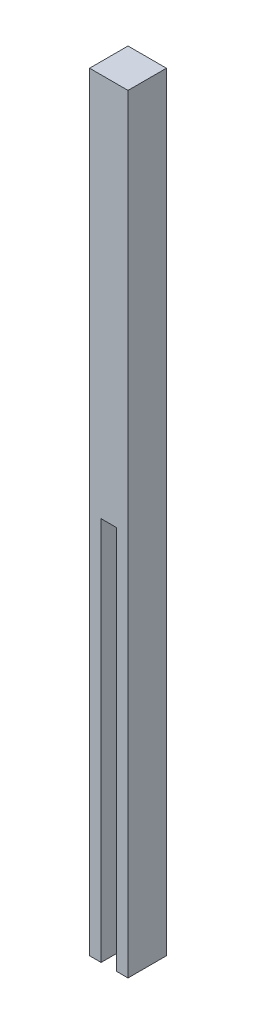
ISO-10303-21;
HEADER;
FILE_DESCRIPTION(('STEP AP214'),'2;1');
FILE_NAME('part.step','',(''),(''),'','','');
FILE_SCHEMA(('AUTOMOTIVE_DESIGN { 1 0 10303 214 1 1 1 1 }'));
ENDSEC;
DATA;
#1=APPLICATION_CONTEXT('core data for automotive mechanical design processes');
#2=APPLICATION_PROTOCOL_DEFINITION('international standard','automotive_design',2000,#1);
#3=PRODUCT_CONTEXT('',#1,'mechanical');
#4=PRODUCT('Part','Part','',(#3));
#5=PRODUCT_RELATED_PRODUCT_CATEGORY('part','',(#4));
#6=PRODUCT_DEFINITION_FORMATION('','',#4);
#7=PRODUCT_DEFINITION_CONTEXT('part definition',#1,'design');
#8=PRODUCT_DEFINITION('design','',#6,#7);
#9=PRODUCT_DEFINITION_SHAPE('','',#8);
#10=(LENGTH_UNIT() NAMED_UNIT(*) SI_UNIT(.MILLI.,.METRE.));
#11=(NAMED_UNIT(*) PLANE_ANGLE_UNIT() SI_UNIT($,.RADIAN.));
#12=(NAMED_UNIT(*) SI_UNIT($,.STERADIAN.) SOLID_ANGLE_UNIT());
#13=UNCERTAINTY_MEASURE_WITH_UNIT(LENGTH_MEASURE(1.E-05),#10,'distance_accuracy_value','');
#14=(GEOMETRIC_REPRESENTATION_CONTEXT(3) GLOBAL_UNCERTAINTY_ASSIGNED_CONTEXT((#13)) GLOBAL_UNIT_ASSIGNED_CONTEXT((#10,
#11,#12)) REPRESENTATION_CONTEXT('',''));
#15=CARTESIAN_POINT('',(0.,0.,0.));
#16=DIRECTION('',(0.,0.,1.));
#17=DIRECTION('',(1.,0.,0.));
#18=AXIS2_PLACEMENT_3D('',#15,#16,#17);
#19=CARTESIAN_POINT('',(-43.4918902303552,2000.,-32.6944400252682));
#20=DIRECTION('',(1.,0.,0.));
#21=DIRECTION('',(0.,0.,-1.));
#22=AXIS2_PLACEMENT_3D('',#19,#20,#21);
#23=PLANE('',#22);
#24=DIRECTION('',(0.,0.,1.));
#25=VECTOR('',#24,1.);
#26=CARTESIAN_POINT('',(-43.4918902303552,0.,-32.6944400252682));
#27=LINE('',#26,#25);
#28=CARTESIAN_POINT('',(-43.4918902303552,0.,-32.6944400252682));
#29=VERTEX_POINT('',#28);
#30=CARTESIAN_POINT('',(-43.4918902303552,0.,67.3055599747318));
#31=VERTEX_POINT('',#30);
#32=EDGE_CURVE('E142',#29,#31,#27,.T.);
#33=ORIENTED_EDGE('',*,*,#32,.T.);
#34=DIRECTION('',(0.,-1.,0.));
#35=VECTOR('',#34,1.);
#36=CARTESIAN_POINT('',(-43.4918902303552,2000.,67.3055599747318));
#37=LINE('',#36,#35);
#38=CARTESIAN_POINT('',(-43.4918902303552,2000.,67.3055599747318));
#39=VERTEX_POINT('',#38);
#40=EDGE_CURVE('E11',#39,#31,#37,.T.);
#41=ORIENTED_EDGE('',*,*,#40,.F.);
#42=DIRECTION('',(0.,0.,1.));
#43=VECTOR('',#42,1.);
#44=CARTESIAN_POINT('',(-43.4918902303552,2000.,-32.6944400252682));
#45=LINE('',#44,#43);
#46=CARTESIAN_POINT('',(-43.4918902303552,2000.,-32.6944400252682));
#47=VERTEX_POINT('',#46);
#48=EDGE_CURVE('E135',#47,#39,#45,.T.);
#49=ORIENTED_EDGE('',*,*,#48,.F.);
#50=DIRECTION('',(0.,-1.,0.));
#51=VECTOR('',#50,1.);
#52=CARTESIAN_POINT('',(-43.4918902303552,2000.,-32.6944400252682));
#53=LINE('',#52,#51);
#54=EDGE_CURVE('E141',#47,#29,#53,.T.);
#55=ORIENTED_EDGE('',*,*,#54,.T.);
#56=EDGE_LOOP('',(#33,#41,#49,#55));
#57=FACE_BOUND('',#56,.T.);
#58=ADVANCED_FACE('F34',(#57),#23,.F.);
#59=CARTESIAN_POINT('',(-43.4918902303552,2000.,67.3055599747318));
#60=DIRECTION('',(0.,0.,-1.));
#61=DIRECTION('',(-1.,0.,0.));
#62=AXIS2_PLACEMENT_3D('',#59,#60,#61);
#63=PLANE('',#62);
#64=DIRECTION('',(1.,0.,0.));
#65=VECTOR('',#64,1.);
#66=CARTESIAN_POINT('',(-43.4918902303552,0.,67.3055599747318));
#67=LINE('',#66,#65);
#68=CARTESIAN_POINT('',(-13.491890230355,0.,67.3055599747318));
#69=VERTEX_POINT('',#68);
#70=EDGE_CURVE('E145',#31,#69,#67,.T.);
#71=ORIENTED_EDGE('',*,*,#70,.T.);
#72=DIRECTION('',(0.,-1.,0.));
#73=VECTOR('',#72,1.);
#74=CARTESIAN_POINT('',(-13.4918902303552,1000.,67.3055599747318));
#75=LINE('',#74,#73);
#76=CARTESIAN_POINT('',(-13.4918902303552,1000.,67.3055599747318));
#77=VERTEX_POINT('',#76);
#78=EDGE_CURVE('E184',#77,#69,#75,.T.);
#79=ORIENTED_EDGE('',*,*,#78,.F.);
#80=DIRECTION('',(1.,0.,0.));
#81=VECTOR('',#80,1.);
#82=CARTESIAN_POINT('',(-13.4918902303552,1000.,67.3055599747318));
#83=LINE('',#82,#81);
#84=CARTESIAN_POINT('',(26.5081097696449,1000.,67.3055599747318));
#85=VERTEX_POINT('',#84);
#86=EDGE_CURVE('E186',#77,#85,#83,.T.);
#87=ORIENTED_EDGE('',*,*,#86,.T.);
#88=DIRECTION('',(0.,-1.,0.));
#89=VECTOR('',#88,1.);
#90=CARTESIAN_POINT('',(26.5081097696449,1000.,67.3055599747318));
#91=LINE('',#90,#89);
#92=CARTESIAN_POINT('',(26.508109769645,0.,67.3055599747318));
#93=VERTEX_POINT('',#92);
#94=EDGE_CURVE('E188',#85,#93,#91,.T.);
#95=ORIENTED_EDGE('',*,*,#94,.T.);
#96=CARTESIAN_POINT('',(56.5081097696448,0.,67.3055599747318));
#97=VERTEX_POINT('',#96);
#98=EDGE_CURVE('E127',#93,#97,#67,.T.);
#99=ORIENTED_EDGE('',*,*,#98,.T.);
#100=DIRECTION('',(0.,-1.,0.));
#101=VECTOR('',#100,1.);
#102=CARTESIAN_POINT('',(56.5081097696448,2000.,67.3055599747318));
#103=LINE('',#102,#101);
#104=CARTESIAN_POINT('',(56.5081097696448,2000.,67.3055599747318));
#105=VERTEX_POINT('',#104);
#106=EDGE_CURVE('E41',#105,#97,#103,.T.);
#107=ORIENTED_EDGE('',*,*,#106,.F.);
#108=DIRECTION('',(1.,0.,0.));
#109=VECTOR('',#108,1.);
#110=CARTESIAN_POINT('',(-43.4918902303552,2000.,67.3055599747318));
#111=LINE('',#110,#109);
#112=EDGE_CURVE('E85',#39,#105,#111,.T.);
#113=ORIENTED_EDGE('',*,*,#112,.F.);
#114=ORIENTED_EDGE('',*,*,#40,.T.);
#115=EDGE_LOOP('',(#71,#79,#87,#95,#99,#107,#113,#114));
#116=FACE_BOUND('',#115,.T.);
#117=ADVANCED_FACE('F171',(#116),#63,.F.);
#118=CARTESIAN_POINT('',(56.5081097696448,2000.,-32.6944400252682));
#119=DIRECTION('',(-1.,0.,0.));
#120=DIRECTION('',(0.,0.,1.));
#121=AXIS2_PLACEMENT_3D('',#118,#119,#120);
#122=PLANE('',#121);
#123=DIRECTION('',(0.,0.,-1.));
#124=VECTOR('',#123,1.);
#125=CARTESIAN_POINT('',(56.5081097696448,0.,-32.6944400252682));
#126=LINE('',#125,#124);
#127=CARTESIAN_POINT('',(56.5081097696448,0.,-32.6944400252682));
#128=VERTEX_POINT('',#127);
#129=EDGE_CURVE('E148',#97,#128,#126,.T.);
#130=ORIENTED_EDGE('',*,*,#129,.T.);
#131=DIRECTION('',(0.,-1.,0.));
#132=VECTOR('',#131,1.);
#133=CARTESIAN_POINT('',(56.5081097696448,2000.,-32.6944400252682));
#134=LINE('',#133,#132);
#135=CARTESIAN_POINT('',(56.5081097696448,2000.,-32.6944400252682));
#136=VERTEX_POINT('',#135);
#137=EDGE_CURVE('E152',#136,#128,#134,.T.);
#138=ORIENTED_EDGE('',*,*,#137,.F.);
#139=DIRECTION('',(0.,0.,-1.));
#140=VECTOR('',#139,1.);
#141=CARTESIAN_POINT('',(56.5081097696448,2000.,-32.6944400252682));
#142=LINE('',#141,#140);
#143=EDGE_CURVE('E138',#105,#136,#142,.T.);
#144=ORIENTED_EDGE('',*,*,#143,.F.);
#145=ORIENTED_EDGE('',*,*,#106,.T.);
#146=EDGE_LOOP('',(#130,#138,#144,#145));
#147=FACE_BOUND('',#146,.T.);
#148=ADVANCED_FACE('F156',(#147),#122,.F.);
#149=CARTESIAN_POINT('',(-43.4918902303552,2000.,-32.6944400252682));
#150=DIRECTION('',(0.,0.,1.));
#151=DIRECTION('',(1.,0.,0.));
#152=AXIS2_PLACEMENT_3D('',#149,#150,#151);
#153=PLANE('',#152);
#154=DIRECTION('',(-1.,0.,0.));
#155=VECTOR('',#154,1.);
#156=CARTESIAN_POINT('',(-43.4918902303552,0.,-32.6944400252682));
#157=LINE('',#156,#155);
#158=EDGE_CURVE('E78',#128,#29,#157,.T.);
#159=ORIENTED_EDGE('',*,*,#158,.T.);
#160=ORIENTED_EDGE('',*,*,#54,.F.);
#161=DIRECTION('',(-1.,0.,0.));
#162=VECTOR('',#161,1.);
#163=CARTESIAN_POINT('',(-43.4918902303552,2000.,-32.6944400252682));
#164=LINE('',#163,#162);
#165=EDGE_CURVE('E57',#136,#47,#164,.T.);
#166=ORIENTED_EDGE('',*,*,#165,.F.);
#167=ORIENTED_EDGE('',*,*,#137,.T.);
#168=EDGE_LOOP('',(#159,#160,#166,#167));
#169=FACE_BOUND('',#168,.T.);
#170=ADVANCED_FACE('F162',(#169),#153,.F.);
#171=CARTESIAN_POINT('',(0.,2000.,0.));
#172=DIRECTION('',(0.,1.,0.));
#173=DIRECTION('',(0.,0.,1.));
#174=AXIS2_PLACEMENT_3D('',#171,#172,#173);
#175=PLANE('',#174);
#176=ORIENTED_EDGE('',*,*,#48,.T.);
#177=ORIENTED_EDGE('',*,*,#112,.T.);
#178=ORIENTED_EDGE('',*,*,#143,.T.);
#179=ORIENTED_EDGE('',*,*,#165,.T.);
#180=EDGE_LOOP('',(#176,#177,#178,#179));
#181=FACE_BOUND('',#180,.T.);
#182=ADVANCED_FACE('F164',(#181),#175,.T.);
#183=CARTESIAN_POINT('',(0.,0.,0.));
#184=DIRECTION('',(0.,1.,0.));
#185=DIRECTION('',(0.,0.,1.));
#186=AXIS2_PLACEMENT_3D('',#183,#184,#185);
#187=PLANE('',#186);
#188=DIRECTION('',(1.,0.,0.));
#189=VECTOR('',#188,1.);
#190=CARTESIAN_POINT('',(-13.491890230355,0.,27.3055599747318));
#191=LINE('',#190,#189);
#192=CARTESIAN_POINT('',(-13.4918902303552,0.,27.3055599747318));
#193=VERTEX_POINT('',#192);
#194=CARTESIAN_POINT('',(26.508109769645,0.,27.3055599747318));
#195=VERTEX_POINT('',#194);
#196=EDGE_CURVE('E117',#193,#195,#191,.T.);
#197=ORIENTED_EDGE('',*,*,#196,.F.);
#198=DIRECTION('',(0.,0.,1.));
#199=VECTOR('',#198,1.);
#200=CARTESIAN_POINT('',(-13.491890230355,0.,27.3055599747318));
#201=LINE('',#200,#199);
#202=EDGE_CURVE('E128',#193,#69,#201,.T.);
#203=ORIENTED_EDGE('',*,*,#202,.T.);
#204=ORIENTED_EDGE('',*,*,#70,.F.);
#205=ORIENTED_EDGE('',*,*,#32,.F.);
#206=ORIENTED_EDGE('',*,*,#158,.F.);
#207=ORIENTED_EDGE('',*,*,#129,.F.);
#208=ORIENTED_EDGE('',*,*,#98,.F.);
#209=DIRECTION('',(0.,0.,1.));
#210=VECTOR('',#209,1.);
#211=CARTESIAN_POINT('',(26.508109769645,0.,27.3055599747318));
#212=LINE('',#211,#210);
#213=EDGE_CURVE('E113',#195,#93,#212,.T.);
#214=ORIENTED_EDGE('',*,*,#213,.F.);
#215=EDGE_LOOP('',(#197,#203,#204,#205,#206,#207,#208,#214));
#216=FACE_BOUND('',#215,.T.);
#217=ADVANCED_FACE('F125',(#216),#187,.F.);
#218=CARTESIAN_POINT('',(-13.4918902303552,1000.,27.3055599747318));
#219=DIRECTION('',(-1.,0.,0.));
#220=DIRECTION('',(0.,-1.,0.));
#221=AXIS2_PLACEMENT_3D('',#218,#219,#220);
#222=PLANE('',#221);
#223=ORIENTED_EDGE('',*,*,#78,.T.);
#224=ORIENTED_EDGE('',*,*,#202,.F.);
#225=DIRECTION('',(0.,-1.,0.));
#226=VECTOR('',#225,1.);
#227=CARTESIAN_POINT('',(-13.4918902303552,1000.,27.3055599747318));
#228=LINE('',#227,#226);
#229=CARTESIAN_POINT('',(-13.4918902303552,1000.,27.3055599747318));
#230=VERTEX_POINT('',#229);
#231=EDGE_CURVE('E48',#230,#193,#228,.T.);
#232=ORIENTED_EDGE('',*,*,#231,.F.);
#233=DIRECTION('',(0.,0.,1.));
#234=VECTOR('',#233,1.);
#235=CARTESIAN_POINT('',(-13.4918902303552,1000.,27.3055599747318));
#236=LINE('',#235,#234);
#237=EDGE_CURVE('E130',#230,#77,#236,.T.);
#238=ORIENTED_EDGE('',*,*,#237,.T.);
#239=EDGE_LOOP('',(#223,#224,#232,#238));
#240=FACE_BOUND('',#239,.T.);
#241=ADVANCED_FACE('F193',(#240),#222,.F.);
#242=CARTESIAN_POINT('',(-13.4918902303552,1000.,27.3055599747318));
#243=DIRECTION('',(0.,-1.,0.));
#244=DIRECTION('',(0.,0.,-1.));
#245=AXIS2_PLACEMENT_3D('',#242,#243,#244);
#246=PLANE('',#245);
#247=ORIENTED_EDGE('',*,*,#86,.F.);
#248=ORIENTED_EDGE('',*,*,#237,.F.);
#249=DIRECTION('',(1.,0.,0.));
#250=VECTOR('',#249,1.);
#251=CARTESIAN_POINT('',(-13.4918902303552,1000.,27.3055599747318));
#252=LINE('',#251,#250);
#253=CARTESIAN_POINT('',(26.5081097696449,1000.,27.3055599747318));
#254=VERTEX_POINT('',#253);
#255=EDGE_CURVE('E116',#230,#254,#252,.T.);
#256=ORIENTED_EDGE('',*,*,#255,.T.);
#257=DIRECTION('',(0.,0.,1.));
#258=VECTOR('',#257,1.);
#259=CARTESIAN_POINT('',(26.5081097696449,1000.,27.3055599747318));
#260=LINE('',#259,#258);
#261=EDGE_CURVE('E115',#254,#85,#260,.T.);
#262=ORIENTED_EDGE('',*,*,#261,.T.);
#263=EDGE_LOOP('',(#247,#248,#256,#262));
#264=FACE_BOUND('',#263,.T.);
#265=ADVANCED_FACE('F195',(#264),#246,.T.);
#266=CARTESIAN_POINT('',(26.5081097696449,1000.,27.3055599747318));
#267=DIRECTION('',(-1.,0.,0.));
#268=DIRECTION('',(0.,-1.,0.));
#269=AXIS2_PLACEMENT_3D('',#266,#267,#268);
#270=PLANE('',#269);
#271=ORIENTED_EDGE('',*,*,#94,.F.);
#272=ORIENTED_EDGE('',*,*,#261,.F.);
#273=DIRECTION('',(0.,-1.,0.));
#274=VECTOR('',#273,1.);
#275=CARTESIAN_POINT('',(26.5081097696449,1000.,27.3055599747318));
#276=LINE('',#275,#274);
#277=EDGE_CURVE('E109',#254,#195,#276,.T.);
#278=ORIENTED_EDGE('',*,*,#277,.T.);
#279=ORIENTED_EDGE('',*,*,#213,.T.);
#280=EDGE_LOOP('',(#271,#272,#278,#279));
#281=FACE_BOUND('',#280,.T.);
#282=ADVANCED_FACE('F111',(#281),#270,.T.);
#283=CARTESIAN_POINT('',(0.,0.,27.3055599747318));
#284=DIRECTION('',(0.,0.,1.));
#285=DIRECTION('',(1.,0.,0.));
#286=AXIS2_PLACEMENT_3D('',#283,#284,#285);
#287=PLANE('',#286);
#288=ORIENTED_EDGE('',*,*,#231,.T.);
#289=ORIENTED_EDGE('',*,*,#196,.T.);
#290=ORIENTED_EDGE('',*,*,#277,.F.);
#291=ORIENTED_EDGE('',*,*,#255,.F.);
#292=EDGE_LOOP('',(#288,#289,#290,#291));
#293=FACE_BOUND('',#292,.T.);
#294=ADVANCED_FACE('F120',(#293),#287,.T.);
#295=CLOSED_SHELL('',(#58,#117,#148,#170,#182,#217,#241,#265,#282,#294));
#296=MANIFOLD_SOLID_BREP('B2',#295);
#297=ADVANCED_BREP_SHAPE_REPRESENTATION('',(#18,#296),#14);
#298=SHAPE_DEFINITION_REPRESENTATION(#9,#297);
ENDSEC;
END-ISO-10303-21;
